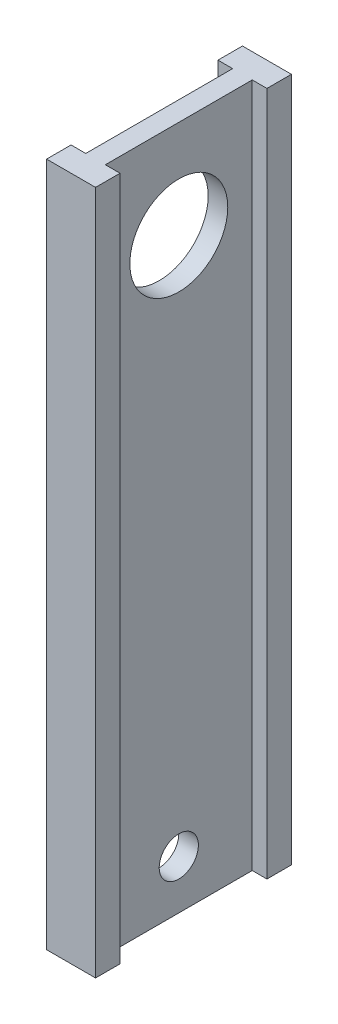
ISO-10303-21;
HEADER;
FILE_DESCRIPTION(('STEP AP214'),'2;1');
FILE_NAME('part.step','',(''),(''),'','','');
FILE_SCHEMA(('AUTOMOTIVE_DESIGN { 1 0 10303 214 1 1 1 1 }'));
ENDSEC;
DATA;
#1=APPLICATION_CONTEXT('core data for automotive mechanical design processes');
#2=APPLICATION_PROTOCOL_DEFINITION('international standard','automotive_design',2000,#1);
#3=PRODUCT_CONTEXT('',#1,'mechanical');
#4=PRODUCT('Part','Part','',(#3));
#5=PRODUCT_RELATED_PRODUCT_CATEGORY('part','',(#4));
#6=PRODUCT_DEFINITION_FORMATION('','',#4);
#7=PRODUCT_DEFINITION_CONTEXT('part definition',#1,'design');
#8=PRODUCT_DEFINITION('design','',#6,#7);
#9=PRODUCT_DEFINITION_SHAPE('','',#8);
#10=(LENGTH_UNIT() NAMED_UNIT(*) SI_UNIT(.MILLI.,.METRE.));
#11=(NAMED_UNIT(*) PLANE_ANGLE_UNIT() SI_UNIT($,.RADIAN.));
#12=(NAMED_UNIT(*) SI_UNIT($,.STERADIAN.) SOLID_ANGLE_UNIT());
#13=UNCERTAINTY_MEASURE_WITH_UNIT(LENGTH_MEASURE(1.E-05),#10,'distance_accuracy_value','');
#14=(GEOMETRIC_REPRESENTATION_CONTEXT(3) GLOBAL_UNCERTAINTY_ASSIGNED_CONTEXT((#13)) GLOBAL_UNIT_ASSIGNED_CONTEXT((#10,
#11,#12)) REPRESENTATION_CONTEXT('',''));
#15=CARTESIAN_POINT('',(0.,0.,0.));
#16=DIRECTION('',(0.,0.,1.));
#17=DIRECTION('',(1.,0.,0.));
#18=AXIS2_PLACEMENT_3D('',#15,#16,#17);
#19=CARTESIAN_POINT('',(18.75,609.556701033717,56.25));
#20=DIRECTION('',(-1.,0.,0.));
#21=DIRECTION('',(0.,0.,1.));
#22=AXIS2_PLACEMENT_3D('',#19,#20,#21);
#23=PLANE('',#22);
#24=DIRECTION('',(0.,0.,-1.));
#25=VECTOR('',#24,1.);
#26=CARTESIAN_POINT('',(18.75,85.2267010336917,56.25));
#27=LINE('',#26,#25);
#28=CARTESIAN_POINT('',(18.75,85.2267010336917,75.));
#29=VERTEX_POINT('',#28);
#30=CARTESIAN_POINT('',(18.75,85.2267010336917,56.25));
#31=VERTEX_POINT('',#30);
#32=EDGE_CURVE('E173',#29,#31,#27,.T.);
#33=ORIENTED_EDGE('',*,*,#32,.T.);
#34=DIRECTION('',(0.,-1.,0.));
#35=VECTOR('',#34,1.);
#36=CARTESIAN_POINT('',(18.75,609.556701033717,56.25));
#37=LINE('',#36,#35);
#38=CARTESIAN_POINT('',(18.75,609.556701033717,56.25));
#39=VERTEX_POINT('',#38);
#40=EDGE_CURVE('E12',#39,#31,#37,.T.);
#41=ORIENTED_EDGE('',*,*,#40,.F.);
#42=DIRECTION('',(0.,0.,-1.));
#43=VECTOR('',#42,1.);
#44=CARTESIAN_POINT('',(18.75,609.556701033717,56.25));
#45=LINE('',#44,#43);
#46=CARTESIAN_POINT('',(18.75,609.556701033717,75.));
#47=VERTEX_POINT('',#46);
#48=EDGE_CURVE('E198',#47,#39,#45,.T.);
#49=ORIENTED_EDGE('',*,*,#48,.F.);
#50=DIRECTION('',(0.,-1.,0.));
#51=VECTOR('',#50,1.);
#52=CARTESIAN_POINT('',(18.75,609.556701033717,75.));
#53=LINE('',#52,#51);
#54=EDGE_CURVE('E168',#47,#29,#53,.T.);
#55=ORIENTED_EDGE('',*,*,#54,.T.);
#56=EDGE_LOOP('',(#33,#41,#49,#55));
#57=FACE_BOUND('',#56,.T.);
#58=ADVANCED_FACE('F55',(#57),#23,.F.);
#59=CARTESIAN_POINT('',(18.75,609.556701033717,56.25));
#60=DIRECTION('',(0.,0.,1.));
#61=DIRECTION('',(1.,0.,0.));
#62=AXIS2_PLACEMENT_3D('',#59,#60,#61);
#63=PLANE('',#62);
#64=DIRECTION('',(-1.,0.,0.));
#65=VECTOR('',#64,1.);
#66=CARTESIAN_POINT('',(18.75,85.2267010336917,56.25));
#67=LINE('',#66,#65);
#68=CARTESIAN_POINT('',(7.50000000000001,85.2267010336917,56.25));
#69=VERTEX_POINT('',#68);
#70=EDGE_CURVE('E180',#31,#69,#67,.T.);
#71=ORIENTED_EDGE('',*,*,#70,.T.);
#72=DIRECTION('',(0.,-1.,0.));
#73=VECTOR('',#72,1.);
#74=CARTESIAN_POINT('',(7.50000000000001,609.556701033717,56.25));
#75=LINE('',#74,#73);
#76=CARTESIAN_POINT('',(7.50000000000001,609.556701033717,56.25));
#77=VERTEX_POINT('',#76);
#78=EDGE_CURVE('E64',#77,#69,#75,.T.);
#79=ORIENTED_EDGE('',*,*,#78,.F.);
#80=DIRECTION('',(-1.,0.,0.));
#81=VECTOR('',#80,1.);
#82=CARTESIAN_POINT('',(18.75,609.556701033717,56.25));
#83=LINE('',#82,#81);
#84=EDGE_CURVE('E124',#39,#77,#83,.T.);
#85=ORIENTED_EDGE('',*,*,#84,.F.);
#86=ORIENTED_EDGE('',*,*,#40,.T.);
#87=EDGE_LOOP('',(#71,#79,#85,#86));
#88=FACE_BOUND('',#87,.T.);
#89=ADVANCED_FACE('F273',(#88),#63,.F.);
#90=CARTESIAN_POINT('',(7.49999999999999,609.556701033717,-56.25));
#91=DIRECTION('',(-1.,0.,0.));
#92=DIRECTION('',(0.,0.,1.));
#93=AXIS2_PLACEMENT_3D('',#90,#91,#92);
#94=PLANE('',#93);
#95=CARTESIAN_POINT('',(7.5,534.556701033717,0.));
#96=DIRECTION('',(1.,0.,0.));
#97=DIRECTION('',(0.,0.,-1.));
#98=AXIS2_PLACEMENT_3D('',#95,#96,#97);
#99=CIRCLE('',#98,37.5);
#100=CARTESIAN_POINT('',(7.49999999999999,534.556701033717,-37.5));
#101=VERTEX_POINT('',#100);
#102=EDGE_CURVE('E222',#101,#101,#99,.T.);
#103=ORIENTED_EDGE('',*,*,#102,.F.);
#104=EDGE_LOOP('',(#103));
#105=FACE_BOUND('',#104,.T.);
#106=CARTESIAN_POINT('',(7.5,122.726701033692,0.));
#107=DIRECTION('',(1.,0.,0.));
#108=DIRECTION('',(0.,0.,-1.));
#109=AXIS2_PLACEMENT_3D('',#106,#107,#108);
#110=CIRCLE('',#109,15.);
#111=CARTESIAN_POINT('',(7.5,122.726701033692,-15.));
#112=VERTEX_POINT('',#111);
#113=EDGE_CURVE('E229',#112,#112,#110,.T.);
#114=ORIENTED_EDGE('',*,*,#113,.F.);
#115=EDGE_LOOP('',(#114));
#116=FACE_BOUND('',#115,.T.);
#117=DIRECTION('',(0.,0.,-1.));
#118=VECTOR('',#117,1.);
#119=CARTESIAN_POINT('',(7.49999999999999,85.2267010336917,-56.25));
#120=LINE('',#119,#118);
#121=CARTESIAN_POINT('',(7.49999999999999,85.2267010336917,-56.25));
#122=VERTEX_POINT('',#121);
#123=EDGE_CURVE('E177',#69,#122,#120,.T.);
#124=ORIENTED_EDGE('',*,*,#123,.T.);
#125=DIRECTION('',(0.,-1.,0.));
#126=VECTOR('',#125,1.);
#127=CARTESIAN_POINT('',(7.49999999999999,609.556701033717,-56.25));
#128=LINE('',#127,#126);
#129=CARTESIAN_POINT('',(7.49999999999999,609.556701033717,-56.25));
#130=VERTEX_POINT('',#129);
#131=EDGE_CURVE('E214',#130,#122,#128,.T.);
#132=ORIENTED_EDGE('',*,*,#131,.F.);
#133=DIRECTION('',(0.,0.,-1.));
#134=VECTOR('',#133,1.);
#135=CARTESIAN_POINT('',(7.49999999999999,609.556701033717,-56.25));
#136=LINE('',#135,#134);
#137=EDGE_CURVE('E234',#77,#130,#136,.T.);
#138=ORIENTED_EDGE('',*,*,#137,.F.);
#139=ORIENTED_EDGE('',*,*,#78,.T.);
#140=EDGE_LOOP('',(#124,#132,#138,#139));
#141=FACE_BOUND('',#140,.T.);
#142=ADVANCED_FACE('F279',(#105,#116,#141),#94,.F.);
#143=CARTESIAN_POINT('',(18.75,609.556701033717,-56.25));
#144=DIRECTION('',(0.,0.,-1.));
#145=DIRECTION('',(-1.,0.,0.));
#146=AXIS2_PLACEMENT_3D('',#143,#144,#145);
#147=PLANE('',#146);
#148=DIRECTION('',(1.,0.,0.));
#149=VECTOR('',#148,1.);
#150=CARTESIAN_POINT('',(18.75,85.2267010336917,-56.25));
#151=LINE('',#150,#149);
#152=CARTESIAN_POINT('',(18.75,85.2267010336917,-56.25));
#153=VERTEX_POINT('',#152);
#154=EDGE_CURVE('E182',#122,#153,#151,.T.);
#155=ORIENTED_EDGE('',*,*,#154,.T.);
#156=DIRECTION('',(0.,-1.,0.));
#157=VECTOR('',#156,1.);
#158=CARTESIAN_POINT('',(18.75,609.556701033717,-56.25));
#159=LINE('',#158,#157);
#160=CARTESIAN_POINT('',(18.75,609.556701033717,-56.25));
#161=VERTEX_POINT('',#160);
#162=EDGE_CURVE('E215',#161,#153,#159,.T.);
#163=ORIENTED_EDGE('',*,*,#162,.F.);
#164=DIRECTION('',(1.,0.,0.));
#165=VECTOR('',#164,1.);
#166=CARTESIAN_POINT('',(18.75,609.556701033717,-56.25));
#167=LINE('',#166,#165);
#168=EDGE_CURVE('E240',#130,#161,#167,.T.);
#169=ORIENTED_EDGE('',*,*,#168,.F.);
#170=ORIENTED_EDGE('',*,*,#131,.T.);
#171=EDGE_LOOP('',(#155,#163,#169,#170));
#172=FACE_BOUND('',#171,.T.);
#173=ADVANCED_FACE('F281',(#172),#147,.F.);
#174=CARTESIAN_POINT('',(18.75,609.556701033717,-75.));
#175=DIRECTION('',(-1.,0.,0.));
#176=DIRECTION('',(0.,0.,1.));
#177=AXIS2_PLACEMENT_3D('',#174,#175,#176);
#178=PLANE('',#177);
#179=DIRECTION('',(0.,0.,-1.));
#180=VECTOR('',#179,1.);
#181=CARTESIAN_POINT('',(18.75,85.2267010336917,-75.));
#182=LINE('',#181,#180);
#183=CARTESIAN_POINT('',(18.75,85.2267010336917,-75.));
#184=VERTEX_POINT('',#183);
#185=EDGE_CURVE('E181',#153,#184,#182,.T.);
#186=ORIENTED_EDGE('',*,*,#185,.T.);
#187=DIRECTION('',(0.,-1.,0.));
#188=VECTOR('',#187,1.);
#189=CARTESIAN_POINT('',(18.75,609.556701033717,-75.));
#190=LINE('',#189,#188);
#191=CARTESIAN_POINT('',(18.75,609.556701033717,-75.));
#192=VERTEX_POINT('',#191);
#193=EDGE_CURVE('E207',#192,#184,#190,.T.);
#194=ORIENTED_EDGE('',*,*,#193,.F.);
#195=DIRECTION('',(0.,0.,-1.));
#196=VECTOR('',#195,1.);
#197=CARTESIAN_POINT('',(18.75,609.556701033717,-75.));
#198=LINE('',#197,#196);
#199=EDGE_CURVE('E239',#161,#192,#198,.T.);
#200=ORIENTED_EDGE('',*,*,#199,.F.);
#201=ORIENTED_EDGE('',*,*,#162,.T.);
#202=EDGE_LOOP('',(#186,#194,#200,#201));
#203=FACE_BOUND('',#202,.T.);
#204=ADVANCED_FACE('F288',(#203),#178,.F.);
#205=CARTESIAN_POINT('',(-18.75,609.556701033717,-75.));
#206=DIRECTION('',(0.,0.,1.));
#207=DIRECTION('',(1.,0.,0.));
#208=AXIS2_PLACEMENT_3D('',#205,#206,#207);
#209=PLANE('',#208);
#210=DIRECTION('',(-1.,0.,0.));
#211=VECTOR('',#210,1.);
#212=CARTESIAN_POINT('',(-18.75,85.2267010336917,-75.));
#213=LINE('',#212,#211);
#214=CARTESIAN_POINT('',(-18.75,85.2267010336917,-75.));
#215=VERTEX_POINT('',#214);
#216=EDGE_CURVE('E183',#184,#215,#213,.T.);
#217=ORIENTED_EDGE('',*,*,#216,.T.);
#218=DIRECTION('',(0.,-1.,0.));
#219=VECTOR('',#218,1.);
#220=CARTESIAN_POINT('',(-18.75,609.556701033717,-75.));
#221=LINE('',#220,#219);
#222=CARTESIAN_POINT('',(-18.75,609.556701033717,-75.));
#223=VERTEX_POINT('',#222);
#224=EDGE_CURVE('E206',#223,#215,#221,.T.);
#225=ORIENTED_EDGE('',*,*,#224,.F.);
#226=DIRECTION('',(-1.,0.,0.));
#227=VECTOR('',#226,1.);
#228=CARTESIAN_POINT('',(-18.75,609.556701033717,-75.));
#229=LINE('',#228,#227);
#230=EDGE_CURVE('E244',#192,#223,#229,.T.);
#231=ORIENTED_EDGE('',*,*,#230,.F.);
#232=ORIENTED_EDGE('',*,*,#193,.T.);
#233=EDGE_LOOP('',(#217,#225,#231,#232));
#234=FACE_BOUND('',#233,.T.);
#235=ADVANCED_FACE('F292',(#234),#209,.F.);
#236=CARTESIAN_POINT('',(-18.75,609.556701033717,-75.));
#237=DIRECTION('',(1.,0.,0.));
#238=DIRECTION('',(0.,0.,-1.));
#239=AXIS2_PLACEMENT_3D('',#236,#237,#238);
#240=PLANE('',#239);
#241=DIRECTION('',(0.,0.,1.));
#242=VECTOR('',#241,1.);
#243=CARTESIAN_POINT('',(-18.75,85.2267010336917,-75.));
#244=LINE('',#243,#242);
#245=CARTESIAN_POINT('',(-18.75,85.2267010336917,-56.25));
#246=VERTEX_POINT('',#245);
#247=EDGE_CURVE('E186',#215,#246,#244,.T.);
#248=ORIENTED_EDGE('',*,*,#247,.T.);
#249=DIRECTION('',(0.,-1.,0.));
#250=VECTOR('',#249,1.);
#251=CARTESIAN_POINT('',(-18.75,609.556701033717,-56.25));
#252=LINE('',#251,#250);
#253=CARTESIAN_POINT('',(-18.75,609.556701033717,-56.25));
#254=VERTEX_POINT('',#253);
#255=EDGE_CURVE('E201',#254,#246,#252,.T.);
#256=ORIENTED_EDGE('',*,*,#255,.F.);
#257=DIRECTION('',(0.,0.,1.));
#258=VECTOR('',#257,1.);
#259=CARTESIAN_POINT('',(-18.75,609.556701033717,-75.));
#260=LINE('',#259,#258);
#261=EDGE_CURVE('E245',#223,#254,#260,.T.);
#262=ORIENTED_EDGE('',*,*,#261,.F.);
#263=ORIENTED_EDGE('',*,*,#224,.T.);
#264=EDGE_LOOP('',(#248,#256,#262,#263));
#265=FACE_BOUND('',#264,.T.);
#266=ADVANCED_FACE('F293',(#265),#240,.F.);
#267=CARTESIAN_POINT('',(-18.75,609.556701033717,-56.25));
#268=DIRECTION('',(0.,0.,-1.));
#269=DIRECTION('',(-1.,0.,0.));
#270=AXIS2_PLACEMENT_3D('',#267,#268,#269);
#271=PLANE('',#270);
#272=DIRECTION('',(1.,0.,0.));
#273=VECTOR('',#272,1.);
#274=CARTESIAN_POINT('',(-18.75,85.2267010336917,-56.25));
#275=LINE('',#274,#273);
#276=CARTESIAN_POINT('',(-7.50000000000001,85.2267010336917,-56.25));
#277=VERTEX_POINT('',#276);
#278=EDGE_CURVE('E188',#246,#277,#275,.T.);
#279=ORIENTED_EDGE('',*,*,#278,.T.);
#280=DIRECTION('',(0.,-1.,0.));
#281=VECTOR('',#280,1.);
#282=CARTESIAN_POINT('',(-7.50000000000001,609.556701033717,-56.25));
#283=LINE('',#282,#281);
#284=CARTESIAN_POINT('',(-7.50000000000001,609.556701033717,-56.25));
#285=VERTEX_POINT('',#284);
#286=EDGE_CURVE('E199',#285,#277,#283,.T.);
#287=ORIENTED_EDGE('',*,*,#286,.F.);
#288=DIRECTION('',(1.,0.,0.));
#289=VECTOR('',#288,1.);
#290=CARTESIAN_POINT('',(-18.75,609.556701033717,-56.25));
#291=LINE('',#290,#289);
#292=EDGE_CURVE('E242',#254,#285,#291,.T.);
#293=ORIENTED_EDGE('',*,*,#292,.F.);
#294=ORIENTED_EDGE('',*,*,#255,.T.);
#295=EDGE_LOOP('',(#279,#287,#293,#294));
#296=FACE_BOUND('',#295,.T.);
#297=ADVANCED_FACE('F253',(#296),#271,.F.);
#298=CARTESIAN_POINT('',(-7.50000000000001,609.556701033717,-56.25));
#299=DIRECTION('',(1.,0.,0.));
#300=DIRECTION('',(0.,0.,-1.));
#301=AXIS2_PLACEMENT_3D('',#298,#299,#300);
#302=PLANE('',#301);
#303=CARTESIAN_POINT('',(-7.50000000000001,534.556701033717,0.));
#304=DIRECTION('',(1.,0.,0.));
#305=DIRECTION('',(0.,0.,-1.));
#306=AXIS2_PLACEMENT_3D('',#303,#304,#305);
#307=CIRCLE('',#306,37.5);
#308=CARTESIAN_POINT('',(-7.50000000000001,534.556701033717,-37.5));
#309=VERTEX_POINT('',#308);
#310=EDGE_CURVE('E54',#309,#309,#307,.T.);
#311=ORIENTED_EDGE('',*,*,#310,.T.);
#312=EDGE_LOOP('',(#311));
#313=FACE_BOUND('',#312,.T.);
#314=CARTESIAN_POINT('',(-7.50000000000001,122.726701033692,0.));
#315=DIRECTION('',(1.,0.,0.));
#316=DIRECTION('',(0.,0.,-1.));
#317=AXIS2_PLACEMENT_3D('',#314,#315,#316);
#318=CIRCLE('',#317,15.);
#319=CARTESIAN_POINT('',(-7.50000000000001,122.726701033692,-15.));
#320=VERTEX_POINT('',#319);
#321=EDGE_CURVE('E218',#320,#320,#318,.T.);
#322=ORIENTED_EDGE('',*,*,#321,.T.);
#323=EDGE_LOOP('',(#322));
#324=FACE_BOUND('',#323,.T.);
#325=DIRECTION('',(0.,0.,1.));
#326=VECTOR('',#325,1.);
#327=CARTESIAN_POINT('',(-7.50000000000001,85.2267010336917,-56.25));
#328=LINE('',#327,#326);
#329=CARTESIAN_POINT('',(-7.49999999999999,85.2267010336917,56.25));
#330=VERTEX_POINT('',#329);
#331=EDGE_CURVE('E191',#277,#330,#328,.T.);
#332=ORIENTED_EDGE('',*,*,#331,.T.);
#333=DIRECTION('',(0.,-1.,0.));
#334=VECTOR('',#333,1.);
#335=CARTESIAN_POINT('',(-7.49999999999999,609.556701033717,56.25));
#336=LINE('',#335,#334);
#337=CARTESIAN_POINT('',(-7.49999999999999,609.556701033717,56.25));
#338=VERTEX_POINT('',#337);
#339=EDGE_CURVE('E164',#338,#330,#336,.T.);
#340=ORIENTED_EDGE('',*,*,#339,.F.);
#341=DIRECTION('',(0.,0.,1.));
#342=VECTOR('',#341,1.);
#343=CARTESIAN_POINT('',(-7.50000000000001,609.556701033717,-56.25));
#344=LINE('',#343,#342);
#345=EDGE_CURVE('E156',#285,#338,#344,.T.);
#346=ORIENTED_EDGE('',*,*,#345,.F.);
#347=ORIENTED_EDGE('',*,*,#286,.T.);
#348=EDGE_LOOP('',(#332,#340,#346,#347));
#349=FACE_BOUND('',#348,.T.);
#350=ADVANCED_FACE('F254',(#313,#324,#349),#302,.F.);
#351=CARTESIAN_POINT('',(-18.75,609.556701033717,56.25));
#352=DIRECTION('',(0.,0.,1.));
#353=DIRECTION('',(1.,0.,0.));
#354=AXIS2_PLACEMENT_3D('',#351,#352,#353);
#355=PLANE('',#354);
#356=DIRECTION('',(-1.,0.,0.));
#357=VECTOR('',#356,1.);
#358=CARTESIAN_POINT('',(-18.75,85.2267010336917,56.25));
#359=LINE('',#358,#357);
#360=CARTESIAN_POINT('',(-18.75,85.2267010336917,56.25));
#361=VERTEX_POINT('',#360);
#362=EDGE_CURVE('E163',#330,#361,#359,.T.);
#363=ORIENTED_EDGE('',*,*,#362,.T.);
#364=DIRECTION('',(0.,-1.,0.));
#365=VECTOR('',#364,1.);
#366=CARTESIAN_POINT('',(-18.75,609.556701033717,56.25));
#367=LINE('',#366,#365);
#368=CARTESIAN_POINT('',(-18.75,609.556701033717,56.25));
#369=VERTEX_POINT('',#368);
#370=EDGE_CURVE('E161',#369,#361,#367,.T.);
#371=ORIENTED_EDGE('',*,*,#370,.F.);
#372=DIRECTION('',(-1.,0.,0.));
#373=VECTOR('',#372,1.);
#374=CARTESIAN_POINT('',(-18.75,609.556701033717,56.25));
#375=LINE('',#374,#373);
#376=EDGE_CURVE('E147',#338,#369,#375,.T.);
#377=ORIENTED_EDGE('',*,*,#376,.F.);
#378=ORIENTED_EDGE('',*,*,#339,.T.);
#379=EDGE_LOOP('',(#363,#371,#377,#378));
#380=FACE_BOUND('',#379,.T.);
#381=ADVANCED_FACE('F165',(#380),#355,.F.);
#382=CARTESIAN_POINT('',(-18.75,609.556701033717,56.25));
#383=DIRECTION('',(1.,0.,0.));
#384=DIRECTION('',(0.,0.,-1.));
#385=AXIS2_PLACEMENT_3D('',#382,#383,#384);
#386=PLANE('',#385);
#387=DIRECTION('',(0.,0.,1.));
#388=VECTOR('',#387,1.);
#389=CARTESIAN_POINT('',(-18.75,85.2267010336917,56.25));
#390=LINE('',#389,#388);
#391=CARTESIAN_POINT('',(-18.75,85.2267010336917,75.));
#392=VERTEX_POINT('',#391);
#393=EDGE_CURVE('E112',#361,#392,#390,.T.);
#394=ORIENTED_EDGE('',*,*,#393,.T.);
#395=DIRECTION('',(0.,-1.,0.));
#396=VECTOR('',#395,1.);
#397=CARTESIAN_POINT('',(-18.75,609.556701033717,75.));
#398=LINE('',#397,#396);
#399=CARTESIAN_POINT('',(-18.75,609.556701033717,75.));
#400=VERTEX_POINT('',#399);
#401=EDGE_CURVE('E167',#400,#392,#398,.T.);
#402=ORIENTED_EDGE('',*,*,#401,.F.);
#403=DIRECTION('',(0.,0.,1.));
#404=VECTOR('',#403,1.);
#405=CARTESIAN_POINT('',(-18.75,609.556701033717,56.25));
#406=LINE('',#405,#404);
#407=EDGE_CURVE('E152',#369,#400,#406,.T.);
#408=ORIENTED_EDGE('',*,*,#407,.F.);
#409=ORIENTED_EDGE('',*,*,#370,.T.);
#410=EDGE_LOOP('',(#394,#402,#408,#409));
#411=FACE_BOUND('',#410,.T.);
#412=ADVANCED_FACE('F169',(#411),#386,.F.);
#413=CARTESIAN_POINT('',(-18.75,609.556701033717,75.));
#414=DIRECTION('',(0.,0.,-1.));
#415=DIRECTION('',(-1.,0.,0.));
#416=AXIS2_PLACEMENT_3D('',#413,#414,#415);
#417=PLANE('',#416);
#418=DIRECTION('',(1.,0.,0.));
#419=VECTOR('',#418,1.);
#420=CARTESIAN_POINT('',(-18.75,85.2267010336917,75.));
#421=LINE('',#420,#419);
#422=EDGE_CURVE('E116',#392,#29,#421,.T.);
#423=ORIENTED_EDGE('',*,*,#422,.T.);
#424=ORIENTED_EDGE('',*,*,#54,.F.);
#425=DIRECTION('',(1.,0.,0.));
#426=VECTOR('',#425,1.);
#427=CARTESIAN_POINT('',(-18.75,609.556701033717,75.));
#428=LINE('',#427,#426);
#429=EDGE_CURVE('E69',#400,#47,#428,.T.);
#430=ORIENTED_EDGE('',*,*,#429,.F.);
#431=ORIENTED_EDGE('',*,*,#401,.T.);
#432=EDGE_LOOP('',(#423,#424,#430,#431));
#433=FACE_BOUND('',#432,.T.);
#434=ADVANCED_FACE('F263',(#433),#417,.F.);
#435=CARTESIAN_POINT('',(0.,609.556701033717,0.));
#436=DIRECTION('',(0.,1.,0.));
#437=DIRECTION('',(0.,0.,1.));
#438=AXIS2_PLACEMENT_3D('',#435,#436,#437);
#439=PLANE('',#438);
#440=ORIENTED_EDGE('',*,*,#48,.T.);
#441=ORIENTED_EDGE('',*,*,#84,.T.);
#442=ORIENTED_EDGE('',*,*,#137,.T.);
#443=ORIENTED_EDGE('',*,*,#168,.T.);
#444=ORIENTED_EDGE('',*,*,#199,.T.);
#445=ORIENTED_EDGE('',*,*,#230,.T.);
#446=ORIENTED_EDGE('',*,*,#261,.T.);
#447=ORIENTED_EDGE('',*,*,#292,.T.);
#448=ORIENTED_EDGE('',*,*,#345,.T.);
#449=ORIENTED_EDGE('',*,*,#376,.T.);
#450=ORIENTED_EDGE('',*,*,#407,.T.);
#451=ORIENTED_EDGE('',*,*,#429,.T.);
#452=EDGE_LOOP('',(#440,#441,#442,#443,#444,#445,#446,#447,#448,#449,#450,#451));
#453=FACE_BOUND('',#452,.T.);
#454=ADVANCED_FACE('F155',(#453),#439,.T.);
#455=CARTESIAN_POINT('',(0.,85.2267010336917,0.));
#456=DIRECTION('',(0.,1.,0.));
#457=DIRECTION('',(0.,0.,1.));
#458=AXIS2_PLACEMENT_3D('',#455,#456,#457);
#459=PLANE('',#458);
#460=ORIENTED_EDGE('',*,*,#32,.F.);
#461=ORIENTED_EDGE('',*,*,#422,.F.);
#462=ORIENTED_EDGE('',*,*,#393,.F.);
#463=ORIENTED_EDGE('',*,*,#362,.F.);
#464=ORIENTED_EDGE('',*,*,#331,.F.);
#465=ORIENTED_EDGE('',*,*,#278,.F.);
#466=ORIENTED_EDGE('',*,*,#247,.F.);
#467=ORIENTED_EDGE('',*,*,#216,.F.);
#468=ORIENTED_EDGE('',*,*,#185,.F.);
#469=ORIENTED_EDGE('',*,*,#154,.F.);
#470=ORIENTED_EDGE('',*,*,#123,.F.);
#471=ORIENTED_EDGE('',*,*,#70,.F.);
#472=EDGE_LOOP('',(#460,#461,#462,#463,#464,#465,#466,#467,#468,#469,#470,#471));
#473=FACE_BOUND('',#472,.T.);
#474=ADVANCED_FACE('F256',(#473),#459,.F.);
#475=CARTESIAN_POINT('',(-742.5,122.726701033692,0.));
#476=DIRECTION('',(1.,0.,0.));
#477=DIRECTION('',(0.,0.,-1.));
#478=AXIS2_PLACEMENT_3D('',#475,#476,#477);
#479=CYLINDRICAL_SURFACE('',#478,15.);
#480=ORIENTED_EDGE('',*,*,#113,.T.);
#481=EDGE_LOOP('',(#480));
#482=FACE_BOUND('',#481,.T.);
#483=ORIENTED_EDGE('',*,*,#321,.F.);
#484=EDGE_LOOP('',(#483));
#485=FACE_BOUND('',#484,.T.);
#486=ADVANCED_FACE('F324',(#482,#485),#479,.F.);
#487=CARTESIAN_POINT('',(-742.5,534.556701033717,0.));
#488=DIRECTION('',(1.,0.,0.));
#489=DIRECTION('',(0.,0.,-1.));
#490=AXIS2_PLACEMENT_3D('',#487,#488,#489);
#491=CYLINDRICAL_SURFACE('',#490,37.5);
#492=ORIENTED_EDGE('',*,*,#102,.T.);
#493=EDGE_LOOP('',(#492));
#494=FACE_BOUND('',#493,.T.);
#495=ORIENTED_EDGE('',*,*,#310,.F.);
#496=EDGE_LOOP('',(#495));
#497=FACE_BOUND('',#496,.T.);
#498=ADVANCED_FACE('F325',(#494,#497),#491,.F.);
#499=CLOSED_SHELL('',(#58,#89,#142,#173,#204,#235,#266,#297,#350,#381,#412,#434,#454,#474,#486,#498));
#500=MANIFOLD_SOLID_BREP('B2',#499);
#501=ADVANCED_BREP_SHAPE_REPRESENTATION('',(#18,#500),#14);
#502=SHAPE_DEFINITION_REPRESENTATION(#9,#501);
ENDSEC;
END-ISO-10303-21;
